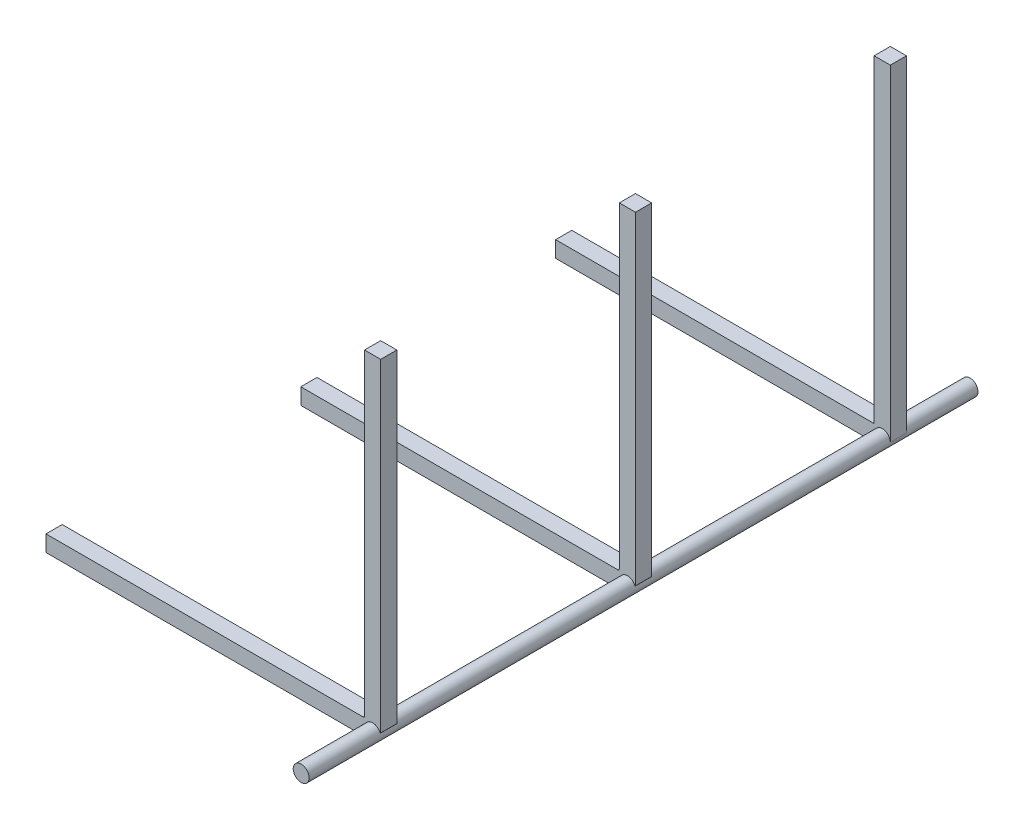
ISO-10303-21;
HEADER;
FILE_DESCRIPTION(('STEP AP214'),'2;1');
FILE_NAME('part.step','',(''),(''),'','','');
FILE_SCHEMA(('AUTOMOTIVE_DESIGN { 1 0 10303 214 1 1 1 1 }'));
ENDSEC;
DATA;
#1=APPLICATION_CONTEXT('core data for automotive mechanical design processes');
#2=APPLICATION_PROTOCOL_DEFINITION('international standard','automotive_design',2000,#1);
#3=PRODUCT_CONTEXT('',#1,'mechanical');
#4=PRODUCT('Part','Part','',(#3));
#5=PRODUCT_RELATED_PRODUCT_CATEGORY('part','',(#4));
#6=PRODUCT_DEFINITION_FORMATION('','',#4);
#7=PRODUCT_DEFINITION_CONTEXT('part definition',#1,'design');
#8=PRODUCT_DEFINITION('design','',#6,#7);
#9=PRODUCT_DEFINITION_SHAPE('','',#8);
#10=(LENGTH_UNIT() NAMED_UNIT(*) SI_UNIT(.MILLI.,.METRE.));
#11=(NAMED_UNIT(*) PLANE_ANGLE_UNIT() SI_UNIT($,.RADIAN.));
#12=(NAMED_UNIT(*) SI_UNIT($,.STERADIAN.) SOLID_ANGLE_UNIT());
#13=UNCERTAINTY_MEASURE_WITH_UNIT(LENGTH_MEASURE(1.E-05),#10,'distance_accuracy_value','');
#14=(GEOMETRIC_REPRESENTATION_CONTEXT(3) GLOBAL_UNCERTAINTY_ASSIGNED_CONTEXT((#13)) GLOBAL_UNIT_ASSIGNED_CONTEXT((#10,
#11,#12)) REPRESENTATION_CONTEXT('',''));
#15=CARTESIAN_POINT('',(0.,0.,0.));
#16=DIRECTION('',(0.,0.,1.));
#17=DIRECTION('',(1.,0.,0.));
#18=AXIS2_PLACEMENT_3D('',#15,#16,#17);
#19=CARTESIAN_POINT('',(0.,0.,275.4));
#20=DIRECTION('',(0.,0.,-1.));
#21=DIRECTION('',(-1.,0.,0.));
#22=AXIS2_PLACEMENT_3D('',#19,#20,#21);
#23=CYLINDRICAL_SURFACE('',#22,25.);
#24=CARTESIAN_POINT('',(0.,0.,224.6));
#25=DIRECTION('',(0.,0.,-1.));
#26=DIRECTION('',(-1.,0.,0.));
#27=AXIS2_PLACEMENT_3D('',#24,#25,#26);
#28=CIRCLE('',#27,25.);
#29=CARTESIAN_POINT('',(0.,-25.,224.6));
#30=VERTEX_POINT('',#29);
#31=CARTESIAN_POINT('',(25.,0.,224.6));
#32=VERTEX_POINT('',#31);
#33=EDGE_CURVE('E142',#30,#32,#28,.T.);
#34=ORIENTED_EDGE('',*,*,#33,.T.);
#35=DIRECTION('',(0.,0.,-1.));
#36=VECTOR('',#35,1.);
#37=CARTESIAN_POINT('',(25.,0.,275.4));
#38=LINE('',#37,#36);
#39=CARTESIAN_POINT('',(25.,0.,275.4));
#40=VERTEX_POINT('',#39);
#41=EDGE_CURVE('E12',#40,#32,#38,.T.);
#42=ORIENTED_EDGE('',*,*,#41,.F.);
#43=CARTESIAN_POINT('',(0.,0.,275.4));
#44=DIRECTION('',(0.,0.,-1.));
#45=DIRECTION('',(-1.,0.,0.));
#46=AXIS2_PLACEMENT_3D('',#43,#44,#45);
#47=CIRCLE('',#46,25.);
#48=CARTESIAN_POINT('',(0.,-25.,275.4));
#49=VERTEX_POINT('',#48);
#50=EDGE_CURVE('E154',#49,#40,#47,.T.);
#51=ORIENTED_EDGE('',*,*,#50,.F.);
#52=DIRECTION('',(0.,0.,-1.));
#53=VECTOR('',#52,1.);
#54=CARTESIAN_POINT('',(0.,-25.,275.4));
#55=LINE('',#54,#53);
#56=EDGE_CURVE('E138',#49,#30,#55,.T.);
#57=ORIENTED_EDGE('',*,*,#56,.T.);
#58=EDGE_LOOP('',(#34,#42,#51,#57));
#59=FACE_BOUND('',#58,.T.);
#60=ADVANCED_FACE('F52',(#59),#23,.F.);
#61=CARTESIAN_POINT('',(25.,0.,275.4));
#62=DIRECTION('',(-1.,0.,0.));
#63=DIRECTION('',(0.,0.,1.));
#64=AXIS2_PLACEMENT_3D('',#61,#62,#63);
#65=PLANE('',#64);
#66=DIRECTION('',(0.,1.,0.));
#67=VECTOR('',#66,1.);
#68=CARTESIAN_POINT('',(25.,0.,224.6));
#69=LINE('',#68,#67);
#70=CARTESIAN_POINT('',(25.,1025.8,224.6));
#71=VERTEX_POINT('',#70);
#72=EDGE_CURVE('E145',#32,#71,#69,.T.);
#73=ORIENTED_EDGE('',*,*,#72,.T.);
#74=DIRECTION('',(0.,0.,-1.));
#75=VECTOR('',#74,1.);
#76=CARTESIAN_POINT('',(25.,1025.8,275.4));
#77=LINE('',#76,#75);
#78=CARTESIAN_POINT('',(25.,1025.8,275.4));
#79=VERTEX_POINT('',#78);
#80=EDGE_CURVE('E60',#79,#71,#77,.T.);
#81=ORIENTED_EDGE('',*,*,#80,.F.);
#82=DIRECTION('',(0.,1.,0.));
#83=VECTOR('',#82,1.);
#84=CARTESIAN_POINT('',(25.,0.,275.4));
#85=LINE('',#84,#83);
#86=EDGE_CURVE('E108',#40,#79,#85,.T.);
#87=ORIENTED_EDGE('',*,*,#86,.F.);
#88=ORIENTED_EDGE('',*,*,#41,.T.);
#89=EDGE_LOOP('',(#73,#81,#87,#88));
#90=FACE_BOUND('',#89,.T.);
#91=ADVANCED_FACE('F179',(#90),#65,.F.);
#92=CARTESIAN_POINT('',(25.,1025.8,275.4));
#93=DIRECTION('',(0.,-1.,0.));
#94=DIRECTION('',(0.,0.,-1.));
#95=AXIS2_PLACEMENT_3D('',#92,#93,#94);
#96=PLANE('',#95);
#97=DIRECTION('',(-1.,0.,0.));
#98=VECTOR('',#97,1.);
#99=CARTESIAN_POINT('',(25.,1025.8,224.6));
#100=LINE('',#99,#98);
#101=CARTESIAN_POINT('',(-25.8,1025.8,224.6));
#102=VERTEX_POINT('',#101);
#103=EDGE_CURVE('E147',#71,#102,#100,.T.);
#104=ORIENTED_EDGE('',*,*,#103,.T.);
#105=DIRECTION('',(0.,0.,-1.));
#106=VECTOR('',#105,1.);
#107=CARTESIAN_POINT('',(-25.8,1025.8,275.4));
#108=LINE('',#107,#106);
#109=CARTESIAN_POINT('',(-25.8,1025.8,275.4));
#110=VERTEX_POINT('',#109);
#111=EDGE_CURVE('E158',#110,#102,#108,.T.);
#112=ORIENTED_EDGE('',*,*,#111,.F.);
#113=DIRECTION('',(-1.,0.,0.));
#114=VECTOR('',#113,1.);
#115=CARTESIAN_POINT('',(25.,1025.8,275.4));
#116=LINE('',#115,#114);
#117=EDGE_CURVE('E166',#79,#110,#116,.T.);
#118=ORIENTED_EDGE('',*,*,#117,.F.);
#119=ORIENTED_EDGE('',*,*,#80,.T.);
#120=EDGE_LOOP('',(#104,#112,#118,#119));
#121=FACE_BOUND('',#120,.T.);
#122=ADVANCED_FACE('F164',(#121),#96,.F.);
#123=CARTESIAN_POINT('',(-25.8,1025.8,275.4));
#124=DIRECTION('',(1.,0.,0.));
#125=DIRECTION('',(0.,1.,0.));
#126=AXIS2_PLACEMENT_3D('',#123,#124,#125);
#127=PLANE('',#126);
#128=DIRECTION('',(0.,-1.,0.));
#129=VECTOR('',#128,1.);
#130=CARTESIAN_POINT('',(-25.8,1025.8,224.6));
#131=LINE('',#130,#129);
#132=CARTESIAN_POINT('',(-25.7999999999999,25.8000000000002,224.6));
#133=VERTEX_POINT('',#132);
#134=EDGE_CURVE('E149',#102,#133,#131,.T.);
#135=ORIENTED_EDGE('',*,*,#134,.T.);
#136=DIRECTION('',(0.,0.,-1.));
#137=VECTOR('',#136,1.);
#138=CARTESIAN_POINT('',(-25.7999999999999,25.8000000000002,275.4));
#139=LINE('',#138,#137);
#140=CARTESIAN_POINT('',(-25.7999999999999,25.8000000000002,275.4));
#141=VERTEX_POINT('',#140);
#142=EDGE_CURVE('E133',#141,#133,#139,.T.);
#143=ORIENTED_EDGE('',*,*,#142,.F.);
#144=DIRECTION('',(0.,-1.,0.));
#145=VECTOR('',#144,1.);
#146=CARTESIAN_POINT('',(-25.8,1025.8,275.4));
#147=LINE('',#146,#145);
#148=EDGE_CURVE('E124',#110,#141,#147,.T.);
#149=ORIENTED_EDGE('',*,*,#148,.F.);
#150=ORIENTED_EDGE('',*,*,#111,.T.);
#151=EDGE_LOOP('',(#135,#143,#149,#150));
#152=FACE_BOUND('',#151,.T.);
#153=ADVANCED_FACE('F172',(#152),#127,.F.);
#154=CARTESIAN_POINT('',(-1025.8,25.7999999999963,275.4));
#155=DIRECTION('',(0.,-1.,0.));
#156=DIRECTION('',(1.,0.,0.));
#157=AXIS2_PLACEMENT_3D('',#154,#155,#156);
#158=PLANE('',#157);
#159=DIRECTION('',(-1.,0.,0.));
#160=VECTOR('',#159,1.);
#161=CARTESIAN_POINT('',(-1025.8,25.7999999999963,224.6));
#162=LINE('',#161,#160);
#163=CARTESIAN_POINT('',(-1025.8,25.7999999999963,224.6));
#164=VERTEX_POINT('',#163);
#165=EDGE_CURVE('E132',#133,#164,#162,.T.);
#166=ORIENTED_EDGE('',*,*,#165,.T.);
#167=DIRECTION('',(0.,0.,-1.));
#168=VECTOR('',#167,1.);
#169=CARTESIAN_POINT('',(-1025.8,25.7999999999963,275.4));
#170=LINE('',#169,#168);
#171=CARTESIAN_POINT('',(-1025.8,25.7999999999963,275.4));
#172=VERTEX_POINT('',#171);
#173=EDGE_CURVE('E129',#172,#164,#170,.T.);
#174=ORIENTED_EDGE('',*,*,#173,.F.);
#175=DIRECTION('',(-1.,0.,0.));
#176=VECTOR('',#175,1.);
#177=CARTESIAN_POINT('',(-1025.8,25.7999999999963,275.4));
#178=LINE('',#177,#176);
#179=EDGE_CURVE('E118',#141,#172,#178,.T.);
#180=ORIENTED_EDGE('',*,*,#179,.F.);
#181=ORIENTED_EDGE('',*,*,#142,.T.);
#182=EDGE_LOOP('',(#166,#174,#180,#181));
#183=FACE_BOUND('',#182,.T.);
#184=ADVANCED_FACE('F130',(#183),#158,.F.);
#185=CARTESIAN_POINT('',(-1025.8,-25.0000000000037,275.4));
#186=DIRECTION('',(1.,0.,0.));
#187=DIRECTION('',(0.,1.,0.));
#188=AXIS2_PLACEMENT_3D('',#185,#186,#187);
#189=PLANE('',#188);
#190=DIRECTION('',(0.,-1.,0.));
#191=VECTOR('',#190,1.);
#192=CARTESIAN_POINT('',(-1025.8,-25.0000000000037,224.6));
#193=LINE('',#192,#191);
#194=CARTESIAN_POINT('',(-1025.8,-25.0000000000037,224.6));
#195=VERTEX_POINT('',#194);
#196=EDGE_CURVE('E94',#164,#195,#193,.T.);
#197=ORIENTED_EDGE('',*,*,#196,.T.);
#198=DIRECTION('',(0.,0.,-1.));
#199=VECTOR('',#198,1.);
#200=CARTESIAN_POINT('',(-1025.8,-25.0000000000037,275.4));
#201=LINE('',#200,#199);
#202=CARTESIAN_POINT('',(-1025.8,-25.0000000000037,275.4));
#203=VERTEX_POINT('',#202);
#204=EDGE_CURVE('E134',#203,#195,#201,.T.);
#205=ORIENTED_EDGE('',*,*,#204,.F.);
#206=DIRECTION('',(0.,-1.,0.));
#207=VECTOR('',#206,1.);
#208=CARTESIAN_POINT('',(-1025.8,-25.0000000000037,275.4));
#209=LINE('',#208,#207);
#210=EDGE_CURVE('E122',#172,#203,#209,.T.);
#211=ORIENTED_EDGE('',*,*,#210,.F.);
#212=ORIENTED_EDGE('',*,*,#173,.T.);
#213=EDGE_LOOP('',(#197,#205,#211,#212));
#214=FACE_BOUND('',#213,.T.);
#215=ADVANCED_FACE('F136',(#214),#189,.F.);
#216=CARTESIAN_POINT('',(0.,-25.,275.4));
#217=DIRECTION('',(0.,1.,0.));
#218=DIRECTION('',(-1.,0.,0.));
#219=AXIS2_PLACEMENT_3D('',#216,#217,#218);
#220=PLANE('',#219);
#221=DIRECTION('',(1.,0.,0.));
#222=VECTOR('',#221,1.);
#223=CARTESIAN_POINT('',(0.,-25.,224.6));
#224=LINE('',#223,#222);
#225=EDGE_CURVE('E100',#195,#30,#224,.T.);
#226=ORIENTED_EDGE('',*,*,#225,.T.);
#227=ORIENTED_EDGE('',*,*,#56,.F.);
#228=DIRECTION('',(1.,0.,0.));
#229=VECTOR('',#228,1.);
#230=CARTESIAN_POINT('',(0.,-25.,275.4));
#231=LINE('',#230,#229);
#232=EDGE_CURVE('E68',#203,#49,#231,.T.);
#233=ORIENTED_EDGE('',*,*,#232,.F.);
#234=ORIENTED_EDGE('',*,*,#204,.T.);
#235=EDGE_LOOP('',(#226,#227,#233,#234));
#236=FACE_BOUND('',#235,.T.);
#237=ADVANCED_FACE('F193',(#236),#220,.F.);
#238=CARTESIAN_POINT('',(0.,0.,275.4));
#239=DIRECTION('',(0.,0.,-1.));
#240=DIRECTION('',(-1.,0.,0.));
#241=AXIS2_PLACEMENT_3D('',#238,#239,#240);
#242=PLANE('',#241);
#243=ORIENTED_EDGE('',*,*,#50,.T.);
#244=ORIENTED_EDGE('',*,*,#86,.T.);
#245=ORIENTED_EDGE('',*,*,#117,.T.);
#246=ORIENTED_EDGE('',*,*,#148,.T.);
#247=ORIENTED_EDGE('',*,*,#179,.T.);
#248=ORIENTED_EDGE('',*,*,#210,.T.);
#249=ORIENTED_EDGE('',*,*,#232,.T.);
#250=EDGE_LOOP('',(#243,#244,#245,#246,#247,#248,#249));
#251=FACE_BOUND('',#250,.T.);
#252=ADVANCED_FACE('F120',(#251),#242,.F.);
#253=CARTESIAN_POINT('',(0.,0.,224.6));
#254=DIRECTION('',(0.,0.,-1.));
#255=DIRECTION('',(-1.,0.,0.));
#256=AXIS2_PLACEMENT_3D('',#253,#254,#255);
#257=PLANE('',#256);
#258=ORIENTED_EDGE('',*,*,#33,.F.);
#259=ORIENTED_EDGE('',*,*,#225,.F.);
#260=ORIENTED_EDGE('',*,*,#196,.F.);
#261=ORIENTED_EDGE('',*,*,#165,.F.);
#262=ORIENTED_EDGE('',*,*,#134,.F.);
#263=ORIENTED_EDGE('',*,*,#103,.F.);
#264=ORIENTED_EDGE('',*,*,#72,.F.);
#265=EDGE_LOOP('',(#258,#259,#260,#261,#262,#263,#264));
#266=FACE_BOUND('',#265,.T.);
#267=ADVANCED_FACE('F170',(#266),#257,.T.);
#268=CLOSED_SHELL('',(#60,#91,#122,#153,#184,#215,#237,#252,#267));
#269=MANIFOLD_SOLID_BREP('B2',#268);
#270=CARTESIAN_POINT('',(0.,0.,1075.4));
#271=DIRECTION('',(0.,0.,-1.));
#272=DIRECTION('',(-1.,0.,0.));
#273=AXIS2_PLACEMENT_3D('',#270,#271,#272);
#274=CYLINDRICAL_SURFACE('',#273,25.);
#275=CARTESIAN_POINT('',(0.,0.,1075.4));
#276=DIRECTION('',(0.,0.,-1.));
#277=DIRECTION('',(-1.,0.,0.));
#278=AXIS2_PLACEMENT_3D('',#275,#276,#277);
#279=CIRCLE('',#278,25.);
#280=CARTESIAN_POINT('',(-9.61538461538454,-23.0769230769231,1075.4));
#281=VERTEX_POINT('',#280);
#282=CARTESIAN_POINT('',(23.0769230769231,9.61538461538462,1075.4));
#283=VERTEX_POINT('',#282);
#284=EDGE_CURVE('E353',#281,#283,#279,.T.);
#285=ORIENTED_EDGE('',*,*,#284,.F.);
#286=DIRECTION('',(0.,0.,-1.));
#287=VECTOR('',#286,1.);
#288=CARTESIAN_POINT('',(-9.61538461538453,-23.0769230769231,1075.4));
#289=LINE('',#288,#287);
#290=CARTESIAN_POINT('',(-9.61538461538454,-23.0769230769231,1024.6));
#291=VERTEX_POINT('',#290);
#292=EDGE_CURVE('E401',#281,#291,#289,.T.);
#293=ORIENTED_EDGE('',*,*,#292,.T.);
#294=CARTESIAN_POINT('',(0.,0.,1024.6));
#295=DIRECTION('',(0.,0.,-1.));
#296=DIRECTION('',(-1.,0.,0.));
#297=AXIS2_PLACEMENT_3D('',#294,#295,#296);
#298=CIRCLE('',#297,25.);
#299=CARTESIAN_POINT('',(23.0769230769231,9.61538461538462,1024.6));
#300=VERTEX_POINT('',#299);
#301=EDGE_CURVE('E379',#291,#300,#298,.T.);
#302=ORIENTED_EDGE('',*,*,#301,.T.);
#303=DIRECTION('',(0.,0.,-1.));
#304=VECTOR('',#303,1.);
#305=CARTESIAN_POINT('',(23.0769230769231,9.61538461538462,1075.4));
#306=LINE('',#305,#304);
#307=EDGE_CURVE('E362',#300,#283,#306,.F.);
#308=ORIENTED_EDGE('',*,*,#307,.T.);
#309=EDGE_LOOP('',(#285,#293,#302,#308));
#310=FACE_BOUND('',#309,.T.);
#311=ADVANCED_FACE('F264',(#310),#274,.F.);
#312=CARTESIAN_POINT('',(25.,0.,1075.4));
#313=DIRECTION('',(-1.,0.,0.));
#314=DIRECTION('',(0.,0.,1.));
#315=AXIS2_PLACEMENT_3D('',#312,#313,#314);
#316=PLANE('',#315);
#317=DIRECTION('',(0.,1.,0.));
#318=VECTOR('',#317,1.);
#319=CARTESIAN_POINT('',(25.,0.,1075.4));
#320=LINE('',#319,#318);
#321=CARTESIAN_POINT('',(25.,10.,1075.4));
#322=VERTEX_POINT('',#321);
#323=CARTESIAN_POINT('',(25.,1025.8,1075.4));
#324=VERTEX_POINT('',#323);
#325=EDGE_CURVE('E340',#322,#324,#320,.T.);
#326=ORIENTED_EDGE('',*,*,#325,.F.);
#327=DIRECTION('',(0.,0.,-1.));
#328=VECTOR('',#327,1.);
#329=CARTESIAN_POINT('',(25.,10.,1075.4));
#330=LINE('',#329,#328);
#331=CARTESIAN_POINT('',(25.,10.,1024.6));
#332=VERTEX_POINT('',#331);
#333=EDGE_CURVE('E413',#322,#332,#330,.T.);
#334=ORIENTED_EDGE('',*,*,#333,.T.);
#335=DIRECTION('',(0.,1.,0.));
#336=VECTOR('',#335,1.);
#337=CARTESIAN_POINT('',(25.,0.,1024.6));
#338=LINE('',#337,#336);
#339=CARTESIAN_POINT('',(25.,1025.8,1024.6));
#340=VERTEX_POINT('',#339);
#341=EDGE_CURVE('E359',#332,#340,#338,.T.);
#342=ORIENTED_EDGE('',*,*,#341,.T.);
#343=DIRECTION('',(0.,0.,-1.));
#344=VECTOR('',#343,1.);
#345=CARTESIAN_POINT('',(25.,1025.8,1075.4));
#346=LINE('',#345,#344);
#347=EDGE_CURVE('E356',#324,#340,#346,.T.);
#348=ORIENTED_EDGE('',*,*,#347,.F.);
#349=EDGE_LOOP('',(#326,#334,#342,#348));
#350=FACE_BOUND('',#349,.T.);
#351=ADVANCED_FACE('F357',(#350),#316,.F.);
#352=CARTESIAN_POINT('',(25.,1025.8,1075.4));
#353=DIRECTION('',(0.,-1.,0.));
#354=DIRECTION('',(0.,0.,-1.));
#355=AXIS2_PLACEMENT_3D('',#352,#353,#354);
#356=PLANE('',#355);
#357=DIRECTION('',(-1.,0.,0.));
#358=VECTOR('',#357,1.);
#359=CARTESIAN_POINT('',(25.,1025.8,1024.6));
#360=LINE('',#359,#358);
#361=CARTESIAN_POINT('',(-25.8,1025.8,1024.6));
#362=VERTEX_POINT('',#361);
#363=EDGE_CURVE('E383',#340,#362,#360,.T.);
#364=ORIENTED_EDGE('',*,*,#363,.T.);
#365=DIRECTION('',(0.,0.,-1.));
#366=VECTOR('',#365,1.);
#367=CARTESIAN_POINT('',(-25.8,1025.8,1075.4));
#368=LINE('',#367,#366);
#369=CARTESIAN_POINT('',(-25.8,1025.8,1075.4));
#370=VERTEX_POINT('',#369);
#371=EDGE_CURVE('E363',#370,#362,#368,.T.);
#372=ORIENTED_EDGE('',*,*,#371,.F.);
#373=DIRECTION('',(-1.,0.,0.));
#374=VECTOR('',#373,1.);
#375=CARTESIAN_POINT('',(25.,1025.8,1075.4));
#376=LINE('',#375,#374);
#377=EDGE_CURVE('E345',#324,#370,#376,.T.);
#378=ORIENTED_EDGE('',*,*,#377,.F.);
#379=ORIENTED_EDGE('',*,*,#347,.T.);
#380=EDGE_LOOP('',(#364,#372,#378,#379));
#381=FACE_BOUND('',#380,.T.);
#382=ADVANCED_FACE('F365',(#381),#356,.F.);
#383=CARTESIAN_POINT('',(-25.8,1025.8,1075.4));
#384=DIRECTION('',(1.,0.,0.));
#385=DIRECTION('',(0.,1.,0.));
#386=AXIS2_PLACEMENT_3D('',#383,#384,#385);
#387=PLANE('',#386);
#388=DIRECTION('',(0.,-1.,0.));
#389=VECTOR('',#388,1.);
#390=CARTESIAN_POINT('',(-25.8,1025.8,1024.6));
#391=LINE('',#390,#389);
#392=CARTESIAN_POINT('',(-25.7999999999999,30.8000000000002,1024.6));
#393=VERTEX_POINT('',#392);
#394=EDGE_CURVE('E385',#362,#393,#391,.T.);
#395=ORIENTED_EDGE('',*,*,#394,.T.);
#396=DIRECTION('',(0.,0.,-1.));
#397=VECTOR('',#396,1.);
#398=CARTESIAN_POINT('',(-25.7999999999999,30.8000000000001,1075.4));
#399=LINE('',#398,#397);
#400=CARTESIAN_POINT('',(-25.7999999999999,30.8000000000002,1075.4));
#401=VERTEX_POINT('',#400);
#402=EDGE_CURVE('E279',#393,#401,#399,.F.);
#403=ORIENTED_EDGE('',*,*,#402,.T.);
#404=DIRECTION('',(0.,-1.,0.));
#405=VECTOR('',#404,1.);
#406=CARTESIAN_POINT('',(-25.8,1025.8,1075.4));
#407=LINE('',#406,#405);
#408=EDGE_CURVE('E367',#370,#401,#407,.T.);
#409=ORIENTED_EDGE('',*,*,#408,.F.);
#410=ORIENTED_EDGE('',*,*,#371,.T.);
#411=EDGE_LOOP('',(#395,#403,#409,#410));
#412=FACE_BOUND('',#411,.T.);
#413=ADVANCED_FACE('F463',(#412),#387,.F.);
#414=CARTESIAN_POINT('',(-1025.8,25.7999999999963,1075.4));
#415=DIRECTION('',(0.,-1.,0.));
#416=DIRECTION('',(1.,0.,0.));
#417=AXIS2_PLACEMENT_3D('',#414,#415,#416);
#418=PLANE('',#417);
#419=DIRECTION('',(-1.,0.,0.));
#420=VECTOR('',#419,1.);
#421=CARTESIAN_POINT('',(-1025.8,25.7999999999963,1075.4));
#422=LINE('',#421,#420);
#423=CARTESIAN_POINT('',(-30.7999999999999,25.8000000000001,1075.4));
#424=VERTEX_POINT('',#423);
#425=CARTESIAN_POINT('',(-1025.8,25.7999999999963,1075.4));
#426=VERTEX_POINT('',#425);
#427=EDGE_CURVE('E369',#424,#426,#422,.T.);
#428=ORIENTED_EDGE('',*,*,#427,.F.);
#429=DIRECTION('',(0.,0.,-1.));
#430=VECTOR('',#429,1.);
#431=CARTESIAN_POINT('',(-30.7999999999999,25.8000000000001,1024.6));
#432=LINE('',#431,#430);
#433=CARTESIAN_POINT('',(-30.7999999999999,25.8000000000001,1024.6));
#434=VERTEX_POINT('',#433);
#435=EDGE_CURVE('E415',#424,#434,#432,.T.);
#436=ORIENTED_EDGE('',*,*,#435,.T.);
#437=DIRECTION('',(-1.,0.,0.));
#438=VECTOR('',#437,1.);
#439=CARTESIAN_POINT('',(-1025.8,25.7999999999963,1024.6));
#440=LINE('',#439,#438);
#441=CARTESIAN_POINT('',(-1025.8,25.7999999999963,1024.6));
#442=VERTEX_POINT('',#441);
#443=EDGE_CURVE('E387',#434,#442,#440,.T.);
#444=ORIENTED_EDGE('',*,*,#443,.T.);
#445=DIRECTION('',(0.,0.,-1.));
#446=VECTOR('',#445,1.);
#447=CARTESIAN_POINT('',(-1025.8,25.7999999999963,1075.4));
#448=LINE('',#447,#446);
#449=EDGE_CURVE('E396',#426,#442,#448,.T.);
#450=ORIENTED_EDGE('',*,*,#449,.F.);
#451=EDGE_LOOP('',(#428,#436,#444,#450));
#452=FACE_BOUND('',#451,.T.);
#453=ADVANCED_FACE('F421',(#452),#418,.F.);
#454=CARTESIAN_POINT('',(-1025.8,-25.0000000000037,1075.4));
#455=DIRECTION('',(1.,0.,0.));
#456=DIRECTION('',(0.,1.,0.));
#457=AXIS2_PLACEMENT_3D('',#454,#455,#456);
#458=PLANE('',#457);
#459=DIRECTION('',(0.,-1.,0.));
#460=VECTOR('',#459,1.);
#461=CARTESIAN_POINT('',(-1025.8,-25.0000000000037,1024.6));
#462=LINE('',#461,#460);
#463=CARTESIAN_POINT('',(-1025.8,-25.0000000000037,1024.6));
#464=VERTEX_POINT('',#463);
#465=EDGE_CURVE('E389',#442,#464,#462,.T.);
#466=ORIENTED_EDGE('',*,*,#465,.T.);
#467=DIRECTION('',(0.,0.,-1.));
#468=VECTOR('',#467,1.);
#469=CARTESIAN_POINT('',(-1025.8,-25.0000000000037,1075.4));
#470=LINE('',#469,#468);
#471=CARTESIAN_POINT('',(-1025.8,-25.0000000000037,1075.4));
#472=VERTEX_POINT('',#471);
#473=EDGE_CURVE('E378',#472,#464,#470,.T.);
#474=ORIENTED_EDGE('',*,*,#473,.F.);
#475=DIRECTION('',(0.,-1.,0.));
#476=VECTOR('',#475,1.);
#477=CARTESIAN_POINT('',(-1025.8,-25.0000000000037,1075.4));
#478=LINE('',#477,#476);
#479=EDGE_CURVE('E374',#426,#472,#478,.T.);
#480=ORIENTED_EDGE('',*,*,#479,.F.);
#481=ORIENTED_EDGE('',*,*,#449,.T.);
#482=EDGE_LOOP('',(#466,#474,#480,#481));
#483=FACE_BOUND('',#482,.T.);
#484=ADVANCED_FACE('F431',(#483),#458,.F.);
#485=CARTESIAN_POINT('',(0.,-25.,1075.4));
#486=DIRECTION('',(0.,1.,0.));
#487=DIRECTION('',(-1.,0.,0.));
#488=AXIS2_PLACEMENT_3D('',#485,#486,#487);
#489=PLANE('',#488);
#490=DIRECTION('',(1.,0.,0.));
#491=VECTOR('',#490,1.);
#492=CARTESIAN_POINT('',(0.,-25.,1024.6));
#493=LINE('',#492,#491);
#494=CARTESIAN_POINT('',(-9.99999999999991,-25.,1024.6));
#495=VERTEX_POINT('',#494);
#496=EDGE_CURVE('E391',#464,#495,#493,.T.);
#497=ORIENTED_EDGE('',*,*,#496,.T.);
#498=DIRECTION('',(0.,0.,-1.));
#499=VECTOR('',#498,1.);
#500=CARTESIAN_POINT('',(-9.99999999999991,-25.,1075.4));
#501=LINE('',#500,#499);
#502=CARTESIAN_POINT('',(-9.99999999999991,-25.,1075.4));
#503=VERTEX_POINT('',#502);
#504=EDGE_CURVE('E408',#495,#503,#501,.F.);
#505=ORIENTED_EDGE('',*,*,#504,.T.);
#506=DIRECTION('',(1.,0.,0.));
#507=VECTOR('',#506,1.);
#508=CARTESIAN_POINT('',(0.,-25.,1075.4));
#509=LINE('',#508,#507);
#510=EDGE_CURVE('E376',#472,#503,#509,.T.);
#511=ORIENTED_EDGE('',*,*,#510,.F.);
#512=ORIENTED_EDGE('',*,*,#473,.T.);
#513=EDGE_LOOP('',(#497,#505,#511,#512));
#514=FACE_BOUND('',#513,.T.);
#515=ADVANCED_FACE('F435',(#514),#489,.F.);
#516=CARTESIAN_POINT('',(0.,0.,1075.4));
#517=DIRECTION('',(0.,0.,-1.));
#518=DIRECTION('',(-1.,0.,0.));
#519=AXIS2_PLACEMENT_3D('',#516,#517,#518);
#520=PLANE('',#519);
#521=ORIENTED_EDGE('',*,*,#510,.T.);
#522=CARTESIAN_POINT('',(-9.99999999999991,-24.,1075.4));
#523=DIRECTION('',(0.,0.,-1.));
#524=DIRECTION('',(-1.,0.,0.));
#525=AXIS2_PLACEMENT_3D('',#522,#523,#524);
#526=CIRCLE('',#525,1.);
#527=EDGE_CURVE('E411',#503,#281,#526,.F.);
#528=ORIENTED_EDGE('',*,*,#527,.T.);
#529=ORIENTED_EDGE('',*,*,#284,.T.);
#530=CARTESIAN_POINT('',(24.,10.,1075.4));
#531=DIRECTION('',(0.,0.,-1.));
#532=DIRECTION('',(-1.,0.,0.));
#533=AXIS2_PLACEMENT_3D('',#530,#531,#532);
#534=CIRCLE('',#533,1.);
#535=EDGE_CURVE('E349',#283,#322,#534,.F.);
#536=ORIENTED_EDGE('',*,*,#535,.T.);
#537=ORIENTED_EDGE('',*,*,#325,.T.);
#538=ORIENTED_EDGE('',*,*,#377,.T.);
#539=ORIENTED_EDGE('',*,*,#408,.T.);
#540=CARTESIAN_POINT('',(-30.7999999999999,30.8000000000001,1075.4));
#541=DIRECTION('',(0.,0.,-1.));
#542=DIRECTION('',(-1.,0.,0.));
#543=AXIS2_PLACEMENT_3D('',#540,#541,#542);
#544=CIRCLE('',#543,5.);
#545=EDGE_CURVE('E50',#401,#424,#544,.T.);
#546=ORIENTED_EDGE('',*,*,#545,.T.);
#547=ORIENTED_EDGE('',*,*,#427,.T.);
#548=ORIENTED_EDGE('',*,*,#479,.T.);
#549=EDGE_LOOP('',(#521,#528,#529,#536,#537,#538,#539,#546,#547,#548));
#550=FACE_BOUND('',#549,.T.);
#551=ADVANCED_FACE('F343',(#550),#520,.F.);
#552=CARTESIAN_POINT('',(0.,0.,1024.6));
#553=DIRECTION('',(0.,0.,-1.));
#554=DIRECTION('',(-1.,0.,0.));
#555=AXIS2_PLACEMENT_3D('',#552,#553,#554);
#556=PLANE('',#555);
#557=ORIENTED_EDGE('',*,*,#301,.F.);
#558=CARTESIAN_POINT('',(-9.99999999999991,-24.,1024.6));
#559=DIRECTION('',(0.,0.,-1.));
#560=DIRECTION('',(-1.,0.,0.));
#561=AXIS2_PLACEMENT_3D('',#558,#559,#560);
#562=CIRCLE('',#561,1.);
#563=EDGE_CURVE('E406',#291,#495,#562,.T.);
#564=ORIENTED_EDGE('',*,*,#563,.T.);
#565=ORIENTED_EDGE('',*,*,#496,.F.);
#566=ORIENTED_EDGE('',*,*,#465,.F.);
#567=ORIENTED_EDGE('',*,*,#443,.F.);
#568=CARTESIAN_POINT('',(-30.7999999999999,30.8000000000001,1024.6));
#569=DIRECTION('',(0.,0.,-1.));
#570=DIRECTION('',(-1.,0.,0.));
#571=AXIS2_PLACEMENT_3D('',#568,#569,#570);
#572=CIRCLE('',#571,5.);
#573=EDGE_CURVE('E272',#434,#393,#572,.F.);
#574=ORIENTED_EDGE('',*,*,#573,.T.);
#575=ORIENTED_EDGE('',*,*,#394,.F.);
#576=ORIENTED_EDGE('',*,*,#363,.F.);
#577=ORIENTED_EDGE('',*,*,#341,.F.);
#578=CARTESIAN_POINT('',(24.,10.,1024.6));
#579=DIRECTION('',(0.,0.,-1.));
#580=DIRECTION('',(-1.,0.,0.));
#581=AXIS2_PLACEMENT_3D('',#578,#579,#580);
#582=CIRCLE('',#581,1.);
#583=EDGE_CURVE('E404',#332,#300,#582,.T.);
#584=ORIENTED_EDGE('',*,*,#583,.T.);
#585=EDGE_LOOP('',(#557,#564,#565,#566,#567,#574,#575,#576,#577,#584));
#586=FACE_BOUND('',#585,.T.);
#587=ADVANCED_FACE('F427',(#586),#556,.T.);
#588=CARTESIAN_POINT('',(-9.99999999999991,-24.,1075.4));
#589=DIRECTION('',(0.,0.,-1.));
#590=DIRECTION('',(-1.,0.,0.));
#591=AXIS2_PLACEMENT_3D('',#588,#589,#590);
#592=CYLINDRICAL_SURFACE('',#591,1.);
#593=ORIENTED_EDGE('',*,*,#527,.F.);
#594=ORIENTED_EDGE('',*,*,#504,.F.);
#595=ORIENTED_EDGE('',*,*,#563,.F.);
#596=ORIENTED_EDGE('',*,*,#292,.F.);
#597=EDGE_LOOP('',(#593,#594,#595,#596));
#598=FACE_BOUND('',#597,.T.);
#599=ADVANCED_FACE('F441',(#598),#592,.T.);
#600=CARTESIAN_POINT('',(24.,10.,1075.4));
#601=DIRECTION('',(0.,0.,-1.));
#602=DIRECTION('',(-1.,0.,0.));
#603=AXIS2_PLACEMENT_3D('',#600,#601,#602);
#604=CYLINDRICAL_SURFACE('',#603,1.);
#605=ORIENTED_EDGE('',*,*,#535,.F.);
#606=ORIENTED_EDGE('',*,*,#307,.F.);
#607=ORIENTED_EDGE('',*,*,#583,.F.);
#608=ORIENTED_EDGE('',*,*,#333,.F.);
#609=EDGE_LOOP('',(#605,#606,#607,#608));
#610=FACE_BOUND('',#609,.T.);
#611=ADVANCED_FACE('F445',(#610),#604,.T.);
#612=CARTESIAN_POINT('',(-30.7999999999999,30.8000000000001,1075.4));
#613=DIRECTION('',(0.,0.,1.));
#614=DIRECTION('',(1.,0.,0.));
#615=AXIS2_PLACEMENT_3D('',#612,#613,#614);
#616=CYLINDRICAL_SURFACE('',#615,5.);
#617=ORIENTED_EDGE('',*,*,#545,.F.);
#618=ORIENTED_EDGE('',*,*,#402,.F.);
#619=ORIENTED_EDGE('',*,*,#573,.F.);
#620=ORIENTED_EDGE('',*,*,#435,.F.);
#621=EDGE_LOOP('',(#617,#618,#619,#620));
#622=FACE_BOUND('',#621,.T.);
#623=ADVANCED_FACE('F266',(#622),#616,.F.);
#624=CLOSED_SHELL('',(#311,#351,#382,#413,#453,#484,#515,#551,#587,#599,#611,#623));
#625=MANIFOLD_SOLID_BREP('B6',#624);
#626=CARTESIAN_POINT('',(0.,0.,1875.4));
#627=DIRECTION('',(0.,0.,-1.));
#628=DIRECTION('',(-1.,0.,0.));
#629=AXIS2_PLACEMENT_3D('',#626,#627,#628);
#630=CYLINDRICAL_SURFACE('',#629,25.);
#631=CARTESIAN_POINT('',(0.,0.,1875.4));
#632=DIRECTION('',(0.,0.,-1.));
#633=DIRECTION('',(-1.,0.,0.));
#634=AXIS2_PLACEMENT_3D('',#631,#632,#633);
#635=CIRCLE('',#634,25.);
#636=CARTESIAN_POINT('',(-9.61538461538454,-23.0769230769231,1875.4));
#637=VERTEX_POINT('',#636);
#638=CARTESIAN_POINT('',(23.0769230769231,9.61538461538462,1875.4));
#639=VERTEX_POINT('',#638);
#640=EDGE_CURVE('E640',#637,#639,#635,.T.);
#641=ORIENTED_EDGE('',*,*,#640,.F.);
#642=DIRECTION('',(0.,0.,-1.));
#643=VECTOR('',#642,1.);
#644=CARTESIAN_POINT('',(-9.61538461538453,-23.0769230769231,1875.4));
#645=LINE('',#644,#643);
#646=CARTESIAN_POINT('',(-9.61538461538454,-23.0769230769231,1824.6));
#647=VERTEX_POINT('',#646);
#648=EDGE_CURVE('E688',#637,#647,#645,.T.);
#649=ORIENTED_EDGE('',*,*,#648,.T.);
#650=CARTESIAN_POINT('',(0.,0.,1824.6));
#651=DIRECTION('',(0.,0.,-1.));
#652=DIRECTION('',(-1.,0.,0.));
#653=AXIS2_PLACEMENT_3D('',#650,#651,#652);
#654=CIRCLE('',#653,25.);
#655=CARTESIAN_POINT('',(23.0769230769231,9.61538461538462,1824.6));
#656=VERTEX_POINT('',#655);
#657=EDGE_CURVE('E666',#647,#656,#654,.T.);
#658=ORIENTED_EDGE('',*,*,#657,.T.);
#659=DIRECTION('',(0.,0.,-1.));
#660=VECTOR('',#659,1.);
#661=CARTESIAN_POINT('',(23.0769230769231,9.61538461538462,1875.4));
#662=LINE('',#661,#660);
#663=EDGE_CURVE('E649',#656,#639,#662,.F.);
#664=ORIENTED_EDGE('',*,*,#663,.T.);
#665=EDGE_LOOP('',(#641,#649,#658,#664));
#666=FACE_BOUND('',#665,.T.);
#667=ADVANCED_FACE('F551',(#666),#630,.F.);
#668=CARTESIAN_POINT('',(25.,0.,1875.4));
#669=DIRECTION('',(-1.,0.,0.));
#670=DIRECTION('',(0.,0.,1.));
#671=AXIS2_PLACEMENT_3D('',#668,#669,#670);
#672=PLANE('',#671);
#673=DIRECTION('',(0.,1.,0.));
#674=VECTOR('',#673,1.);
#675=CARTESIAN_POINT('',(25.,0.,1875.4));
#676=LINE('',#675,#674);
#677=CARTESIAN_POINT('',(25.,10.,1875.4));
#678=VERTEX_POINT('',#677);
#679=CARTESIAN_POINT('',(25.,1025.8,1875.4));
#680=VERTEX_POINT('',#679);
#681=EDGE_CURVE('E627',#678,#680,#676,.T.);
#682=ORIENTED_EDGE('',*,*,#681,.F.);
#683=DIRECTION('',(0.,0.,-1.));
#684=VECTOR('',#683,1.);
#685=CARTESIAN_POINT('',(25.,10.,1875.4));
#686=LINE('',#685,#684);
#687=CARTESIAN_POINT('',(25.,10.,1824.6));
#688=VERTEX_POINT('',#687);
#689=EDGE_CURVE('E700',#678,#688,#686,.T.);
#690=ORIENTED_EDGE('',*,*,#689,.T.);
#691=DIRECTION('',(0.,1.,0.));
#692=VECTOR('',#691,1.);
#693=CARTESIAN_POINT('',(25.,0.,1824.6));
#694=LINE('',#693,#692);
#695=CARTESIAN_POINT('',(25.,1025.8,1824.6));
#696=VERTEX_POINT('',#695);
#697=EDGE_CURVE('E646',#688,#696,#694,.T.);
#698=ORIENTED_EDGE('',*,*,#697,.T.);
#699=DIRECTION('',(0.,0.,-1.));
#700=VECTOR('',#699,1.);
#701=CARTESIAN_POINT('',(25.,1025.8,1875.4));
#702=LINE('',#701,#700);
#703=EDGE_CURVE('E643',#680,#696,#702,.T.);
#704=ORIENTED_EDGE('',*,*,#703,.F.);
#705=EDGE_LOOP('',(#682,#690,#698,#704));
#706=FACE_BOUND('',#705,.T.);
#707=ADVANCED_FACE('F644',(#706),#672,.F.);
#708=CARTESIAN_POINT('',(25.,1025.8,1875.4));
#709=DIRECTION('',(0.,-1.,0.));
#710=DIRECTION('',(0.,0.,-1.));
#711=AXIS2_PLACEMENT_3D('',#708,#709,#710);
#712=PLANE('',#711);
#713=DIRECTION('',(-1.,0.,0.));
#714=VECTOR('',#713,1.);
#715=CARTESIAN_POINT('',(25.,1025.8,1824.6));
#716=LINE('',#715,#714);
#717=CARTESIAN_POINT('',(-25.8,1025.8,1824.6));
#718=VERTEX_POINT('',#717);
#719=EDGE_CURVE('E670',#696,#718,#716,.T.);
#720=ORIENTED_EDGE('',*,*,#719,.T.);
#721=DIRECTION('',(0.,0.,-1.));
#722=VECTOR('',#721,1.);
#723=CARTESIAN_POINT('',(-25.8,1025.8,1875.4));
#724=LINE('',#723,#722);
#725=CARTESIAN_POINT('',(-25.8,1025.8,1875.4));
#726=VERTEX_POINT('',#725);
#727=EDGE_CURVE('E650',#726,#718,#724,.T.);
#728=ORIENTED_EDGE('',*,*,#727,.F.);
#729=DIRECTION('',(-1.,0.,0.));
#730=VECTOR('',#729,1.);
#731=CARTESIAN_POINT('',(25.,1025.8,1875.4));
#732=LINE('',#731,#730);
#733=EDGE_CURVE('E632',#680,#726,#732,.T.);
#734=ORIENTED_EDGE('',*,*,#733,.F.);
#735=ORIENTED_EDGE('',*,*,#703,.T.);
#736=EDGE_LOOP('',(#720,#728,#734,#735));
#737=FACE_BOUND('',#736,.T.);
#738=ADVANCED_FACE('F652',(#737),#712,.F.);
#739=CARTESIAN_POINT('',(-25.8,1025.8,1875.4));
#740=DIRECTION('',(1.,0.,0.));
#741=DIRECTION('',(0.,1.,0.));
#742=AXIS2_PLACEMENT_3D('',#739,#740,#741);
#743=PLANE('',#742);
#744=DIRECTION('',(0.,-1.,0.));
#745=VECTOR('',#744,1.);
#746=CARTESIAN_POINT('',(-25.8,1025.8,1824.6));
#747=LINE('',#746,#745);
#748=CARTESIAN_POINT('',(-25.7999999999999,30.8000000000002,1824.6));
#749=VERTEX_POINT('',#748);
#750=EDGE_CURVE('E672',#718,#749,#747,.T.);
#751=ORIENTED_EDGE('',*,*,#750,.T.);
#752=DIRECTION('',(0.,0.,-1.));
#753=VECTOR('',#752,1.);
#754=CARTESIAN_POINT('',(-25.7999999999999,30.8000000000001,1875.4));
#755=LINE('',#754,#753);
#756=CARTESIAN_POINT('',(-25.7999999999999,30.8000000000002,1875.4));
#757=VERTEX_POINT('',#756);
#758=EDGE_CURVE('E566',#749,#757,#755,.F.);
#759=ORIENTED_EDGE('',*,*,#758,.T.);
#760=DIRECTION('',(0.,-1.,0.));
#761=VECTOR('',#760,1.);
#762=CARTESIAN_POINT('',(-25.8,1025.8,1875.4));
#763=LINE('',#762,#761);
#764=EDGE_CURVE('E654',#726,#757,#763,.T.);
#765=ORIENTED_EDGE('',*,*,#764,.F.);
#766=ORIENTED_EDGE('',*,*,#727,.T.);
#767=EDGE_LOOP('',(#751,#759,#765,#766));
#768=FACE_BOUND('',#767,.T.);
#769=ADVANCED_FACE('F750',(#768),#743,.F.);
#770=CARTESIAN_POINT('',(-1025.8,25.7999999999963,1875.4));
#771=DIRECTION('',(0.,-1.,0.));
#772=DIRECTION('',(1.,0.,0.));
#773=AXIS2_PLACEMENT_3D('',#770,#771,#772);
#774=PLANE('',#773);
#775=DIRECTION('',(-1.,0.,0.));
#776=VECTOR('',#775,1.);
#777=CARTESIAN_POINT('',(-1025.8,25.7999999999963,1875.4));
#778=LINE('',#777,#776);
#779=CARTESIAN_POINT('',(-30.7999999999999,25.8000000000001,1875.4));
#780=VERTEX_POINT('',#779);
#781=CARTESIAN_POINT('',(-1025.8,25.7999999999963,1875.4));
#782=VERTEX_POINT('',#781);
#783=EDGE_CURVE('E656',#780,#782,#778,.T.);
#784=ORIENTED_EDGE('',*,*,#783,.F.);
#785=DIRECTION('',(0.,0.,-1.));
#786=VECTOR('',#785,1.);
#787=CARTESIAN_POINT('',(-30.7999999999999,25.8000000000001,1824.6));
#788=LINE('',#787,#786);
#789=CARTESIAN_POINT('',(-30.7999999999999,25.8000000000001,1824.6));
#790=VERTEX_POINT('',#789);
#791=EDGE_CURVE('E702',#780,#790,#788,.T.);
#792=ORIENTED_EDGE('',*,*,#791,.T.);
#793=DIRECTION('',(-1.,0.,0.));
#794=VECTOR('',#793,1.);
#795=CARTESIAN_POINT('',(-1025.8,25.7999999999963,1824.6));
#796=LINE('',#795,#794);
#797=CARTESIAN_POINT('',(-1025.8,25.7999999999963,1824.6));
#798=VERTEX_POINT('',#797);
#799=EDGE_CURVE('E674',#790,#798,#796,.T.);
#800=ORIENTED_EDGE('',*,*,#799,.T.);
#801=DIRECTION('',(0.,0.,-1.));
#802=VECTOR('',#801,1.);
#803=CARTESIAN_POINT('',(-1025.8,25.7999999999963,1875.4));
#804=LINE('',#803,#802);
#805=EDGE_CURVE('E683',#782,#798,#804,.T.);
#806=ORIENTED_EDGE('',*,*,#805,.F.);
#807=EDGE_LOOP('',(#784,#792,#800,#806));
#808=FACE_BOUND('',#807,.T.);
#809=ADVANCED_FACE('F708',(#808),#774,.F.);
#810=CARTESIAN_POINT('',(-1025.8,-25.0000000000037,1875.4));
#811=DIRECTION('',(1.,0.,0.));
#812=DIRECTION('',(0.,1.,0.));
#813=AXIS2_PLACEMENT_3D('',#810,#811,#812);
#814=PLANE('',#813);
#815=DIRECTION('',(0.,-1.,0.));
#816=VECTOR('',#815,1.);
#817=CARTESIAN_POINT('',(-1025.8,-25.0000000000037,1824.6));
#818=LINE('',#817,#816);
#819=CARTESIAN_POINT('',(-1025.8,-25.0000000000037,1824.6));
#820=VERTEX_POINT('',#819);
#821=EDGE_CURVE('E676',#798,#820,#818,.T.);
#822=ORIENTED_EDGE('',*,*,#821,.T.);
#823=DIRECTION('',(0.,0.,-1.));
#824=VECTOR('',#823,1.);
#825=CARTESIAN_POINT('',(-1025.8,-25.0000000000037,1875.4));
#826=LINE('',#825,#824);
#827=CARTESIAN_POINT('',(-1025.8,-25.0000000000037,1875.4));
#828=VERTEX_POINT('',#827);
#829=EDGE_CURVE('E665',#828,#820,#826,.T.);
#830=ORIENTED_EDGE('',*,*,#829,.F.);
#831=DIRECTION('',(0.,-1.,0.));
#832=VECTOR('',#831,1.);
#833=CARTESIAN_POINT('',(-1025.8,-25.0000000000037,1875.4));
#834=LINE('',#833,#832);
#835=EDGE_CURVE('E661',#782,#828,#834,.T.);
#836=ORIENTED_EDGE('',*,*,#835,.F.);
#837=ORIENTED_EDGE('',*,*,#805,.T.);
#838=EDGE_LOOP('',(#822,#830,#836,#837));
#839=FACE_BOUND('',#838,.T.);
#840=ADVANCED_FACE('F718',(#839),#814,.F.);
#841=CARTESIAN_POINT('',(0.,-25.,1875.4));
#842=DIRECTION('',(0.,1.,0.));
#843=DIRECTION('',(-1.,0.,0.));
#844=AXIS2_PLACEMENT_3D('',#841,#842,#843);
#845=PLANE('',#844);
#846=DIRECTION('',(1.,0.,0.));
#847=VECTOR('',#846,1.);
#848=CARTESIAN_POINT('',(0.,-25.,1824.6));
#849=LINE('',#848,#847);
#850=CARTESIAN_POINT('',(-9.99999999999991,-25.,1824.6));
#851=VERTEX_POINT('',#850);
#852=EDGE_CURVE('E678',#820,#851,#849,.T.);
#853=ORIENTED_EDGE('',*,*,#852,.T.);
#854=DIRECTION('',(0.,0.,-1.));
#855=VECTOR('',#854,1.);
#856=CARTESIAN_POINT('',(-9.99999999999991,-25.,1875.4));
#857=LINE('',#856,#855);
#858=CARTESIAN_POINT('',(-9.99999999999991,-25.,1875.4));
#859=VERTEX_POINT('',#858);
#860=EDGE_CURVE('E695',#851,#859,#857,.F.);
#861=ORIENTED_EDGE('',*,*,#860,.T.);
#862=DIRECTION('',(1.,0.,0.));
#863=VECTOR('',#862,1.);
#864=CARTESIAN_POINT('',(0.,-25.,1875.4));
#865=LINE('',#864,#863);
#866=EDGE_CURVE('E663',#828,#859,#865,.T.);
#867=ORIENTED_EDGE('',*,*,#866,.F.);
#868=ORIENTED_EDGE('',*,*,#829,.T.);
#869=EDGE_LOOP('',(#853,#861,#867,#868));
#870=FACE_BOUND('',#869,.T.);
#871=ADVANCED_FACE('F722',(#870),#845,.F.);
#872=CARTESIAN_POINT('',(0.,0.,1875.4));
#873=DIRECTION('',(0.,0.,-1.));
#874=DIRECTION('',(-1.,0.,0.));
#875=AXIS2_PLACEMENT_3D('',#872,#873,#874);
#876=PLANE('',#875);
#877=ORIENTED_EDGE('',*,*,#866,.T.);
#878=CARTESIAN_POINT('',(-9.99999999999991,-24.,1875.4));
#879=DIRECTION('',(0.,0.,-1.));
#880=DIRECTION('',(-1.,0.,0.));
#881=AXIS2_PLACEMENT_3D('',#878,#879,#880);
#882=CIRCLE('',#881,1.);
#883=EDGE_CURVE('E698',#859,#637,#882,.F.);
#884=ORIENTED_EDGE('',*,*,#883,.T.);
#885=ORIENTED_EDGE('',*,*,#640,.T.);
#886=CARTESIAN_POINT('',(24.,10.,1875.4));
#887=DIRECTION('',(0.,0.,-1.));
#888=DIRECTION('',(-1.,0.,0.));
#889=AXIS2_PLACEMENT_3D('',#886,#887,#888);
#890=CIRCLE('',#889,1.);
#891=EDGE_CURVE('E636',#639,#678,#890,.F.);
#892=ORIENTED_EDGE('',*,*,#891,.T.);
#893=ORIENTED_EDGE('',*,*,#681,.T.);
#894=ORIENTED_EDGE('',*,*,#733,.T.);
#895=ORIENTED_EDGE('',*,*,#764,.T.);
#896=CARTESIAN_POINT('',(-30.7999999999999,30.8000000000001,1875.4));
#897=DIRECTION('',(0.,0.,-1.));
#898=DIRECTION('',(-1.,0.,0.));
#899=AXIS2_PLACEMENT_3D('',#896,#897,#898);
#900=CIRCLE('',#899,5.);
#901=EDGE_CURVE('E262',#757,#780,#900,.T.);
#902=ORIENTED_EDGE('',*,*,#901,.T.);
#903=ORIENTED_EDGE('',*,*,#783,.T.);
#904=ORIENTED_EDGE('',*,*,#835,.T.);
#905=EDGE_LOOP('',(#877,#884,#885,#892,#893,#894,#895,#902,#903,#904));
#906=FACE_BOUND('',#905,.T.);
#907=ADVANCED_FACE('F630',(#906),#876,.F.);
#908=CARTESIAN_POINT('',(0.,0.,1824.6));
#909=DIRECTION('',(0.,0.,-1.));
#910=DIRECTION('',(-1.,0.,0.));
#911=AXIS2_PLACEMENT_3D('',#908,#909,#910);
#912=PLANE('',#911);
#913=ORIENTED_EDGE('',*,*,#657,.F.);
#914=CARTESIAN_POINT('',(-9.99999999999991,-24.,1824.6));
#915=DIRECTION('',(0.,0.,-1.));
#916=DIRECTION('',(-1.,0.,0.));
#917=AXIS2_PLACEMENT_3D('',#914,#915,#916);
#918=CIRCLE('',#917,1.);
#919=EDGE_CURVE('E693',#647,#851,#918,.T.);
#920=ORIENTED_EDGE('',*,*,#919,.T.);
#921=ORIENTED_EDGE('',*,*,#852,.F.);
#922=ORIENTED_EDGE('',*,*,#821,.F.);
#923=ORIENTED_EDGE('',*,*,#799,.F.);
#924=CARTESIAN_POINT('',(-30.7999999999999,30.8000000000001,1824.6));
#925=DIRECTION('',(0.,0.,-1.));
#926=DIRECTION('',(-1.,0.,0.));
#927=AXIS2_PLACEMENT_3D('',#924,#925,#926);
#928=CIRCLE('',#927,5.);
#929=EDGE_CURVE('E559',#790,#749,#928,.F.);
#930=ORIENTED_EDGE('',*,*,#929,.T.);
#931=ORIENTED_EDGE('',*,*,#750,.F.);
#932=ORIENTED_EDGE('',*,*,#719,.F.);
#933=ORIENTED_EDGE('',*,*,#697,.F.);
#934=CARTESIAN_POINT('',(24.,10.,1824.6));
#935=DIRECTION('',(0.,0.,-1.));
#936=DIRECTION('',(-1.,0.,0.));
#937=AXIS2_PLACEMENT_3D('',#934,#935,#936);
#938=CIRCLE('',#937,1.);
#939=EDGE_CURVE('E691',#688,#656,#938,.T.);
#940=ORIENTED_EDGE('',*,*,#939,.T.);
#941=EDGE_LOOP('',(#913,#920,#921,#922,#923,#930,#931,#932,#933,#940));
#942=FACE_BOUND('',#941,.T.);
#943=ADVANCED_FACE('F714',(#942),#912,.T.);
#944=CARTESIAN_POINT('',(-9.99999999999991,-24.,1875.4));
#945=DIRECTION('',(0.,0.,-1.));
#946=DIRECTION('',(-1.,0.,0.));
#947=AXIS2_PLACEMENT_3D('',#944,#945,#946);
#948=CYLINDRICAL_SURFACE('',#947,1.);
#949=ORIENTED_EDGE('',*,*,#883,.F.);
#950=ORIENTED_EDGE('',*,*,#860,.F.);
#951=ORIENTED_EDGE('',*,*,#919,.F.);
#952=ORIENTED_EDGE('',*,*,#648,.F.);
#953=EDGE_LOOP('',(#949,#950,#951,#952));
#954=FACE_BOUND('',#953,.T.);
#955=ADVANCED_FACE('F728',(#954),#948,.T.);
#956=CARTESIAN_POINT('',(24.,10.,1875.4));
#957=DIRECTION('',(0.,0.,-1.));
#958=DIRECTION('',(-1.,0.,0.));
#959=AXIS2_PLACEMENT_3D('',#956,#957,#958);
#960=CYLINDRICAL_SURFACE('',#959,1.);
#961=ORIENTED_EDGE('',*,*,#891,.F.);
#962=ORIENTED_EDGE('',*,*,#663,.F.);
#963=ORIENTED_EDGE('',*,*,#939,.F.);
#964=ORIENTED_EDGE('',*,*,#689,.F.);
#965=EDGE_LOOP('',(#961,#962,#963,#964));
#966=FACE_BOUND('',#965,.T.);
#967=ADVANCED_FACE('F732',(#966),#960,.T.);
#968=CARTESIAN_POINT('',(-30.7999999999999,30.8000000000001,1875.4));
#969=DIRECTION('',(0.,0.,1.));
#970=DIRECTION('',(1.,0.,0.));
#971=AXIS2_PLACEMENT_3D('',#968,#969,#970);
#972=CYLINDRICAL_SURFACE('',#971,5.);
#973=ORIENTED_EDGE('',*,*,#901,.F.);
#974=ORIENTED_EDGE('',*,*,#758,.F.);
#975=ORIENTED_EDGE('',*,*,#929,.F.);
#976=ORIENTED_EDGE('',*,*,#791,.F.);
#977=EDGE_LOOP('',(#973,#974,#975,#976));
#978=FACE_BOUND('',#977,.T.);
#979=ADVANCED_FACE('F553',(#978),#972,.F.);
#980=CLOSED_SHELL('',(#667,#707,#738,#769,#809,#840,#871,#907,#943,#955,#967,#979));
#981=MANIFOLD_SOLID_BREP('B44',#980);
#982=CARTESIAN_POINT('',(0.,0.,2100.));
#983=DIRECTION('',(0.,0.,-1.));
#984=DIRECTION('',(-1.,0.,0.));
#985=AXIS2_PLACEMENT_3D('',#982,#983,#984);
#986=CYLINDRICAL_SURFACE('',#985,25.);
#987=CARTESIAN_POINT('',(0.,0.,2100.));
#988=DIRECTION('',(0.,0.,1.));
#989=DIRECTION('',(1.,0.,0.));
#990=AXIS2_PLACEMENT_3D('',#987,#988,#989);
#991=CIRCLE('',#990,25.);
#992=CARTESIAN_POINT('',(25.,0.,2100.));
#993=VERTEX_POINT('',#992);
#994=EDGE_CURVE('E550',#993,#993,#991,.T.);
#995=ORIENTED_EDGE('',*,*,#994,.F.);
#996=EDGE_LOOP('',(#995));
#997=FACE_BOUND('',#996,.T.);
#998=CARTESIAN_POINT('',(0.,0.,0.));
#999=DIRECTION('',(0.,0.,1.));
#1000=DIRECTION('',(1.,0.,0.));
#1001=AXIS2_PLACEMENT_3D('',#998,#999,#1000);
#1002=CIRCLE('',#1001,25.);
#1003=CARTESIAN_POINT('',(25.,0.,0.));
#1004=VERTEX_POINT('',#1003);
#1005=EDGE_CURVE('E834',#1004,#1004,#1002,.T.);
#1006=ORIENTED_EDGE('',*,*,#1005,.T.);
#1007=EDGE_LOOP('',(#1006));
#1008=FACE_BOUND('',#1007,.T.);
#1009=ADVANCED_FACE('F831',(#997,#1008),#986,.T.);
#1010=CARTESIAN_POINT('',(0.,0.,2100.));
#1011=DIRECTION('',(0.,0.,1.));
#1012=DIRECTION('',(1.,0.,0.));
#1013=AXIS2_PLACEMENT_3D('',#1010,#1011,#1012);
#1014=PLANE('',#1013);
#1015=ORIENTED_EDGE('',*,*,#994,.T.);
#1016=EDGE_LOOP('',(#1015));
#1017=FACE_BOUND('',#1016,.T.);
#1018=ADVANCED_FACE('F846',(#1017),#1014,.T.);
#1019=CARTESIAN_POINT('',(0.,0.,0.));
#1020=DIRECTION('',(0.,0.,1.));
#1021=DIRECTION('',(1.,0.,0.));
#1022=AXIS2_PLACEMENT_3D('',#1019,#1020,#1021);
#1023=PLANE('',#1022);
#1024=ORIENTED_EDGE('',*,*,#1005,.F.);
#1025=EDGE_LOOP('',(#1024));
#1026=FACE_BOUND('',#1025,.T.);
#1027=ADVANCED_FACE('F844',(#1026),#1023,.F.);
#1028=CLOSED_SHELL('',(#1009,#1018,#1027));
#1029=MANIFOLD_SOLID_BREP('B256',#1028);
#1030=ADVANCED_BREP_SHAPE_REPRESENTATION('',(#18,#269,#625,#981,#1029),#14);
#1031=SHAPE_DEFINITION_REPRESENTATION(#9,#1030);
ENDSEC;
END-ISO-10303-21;
